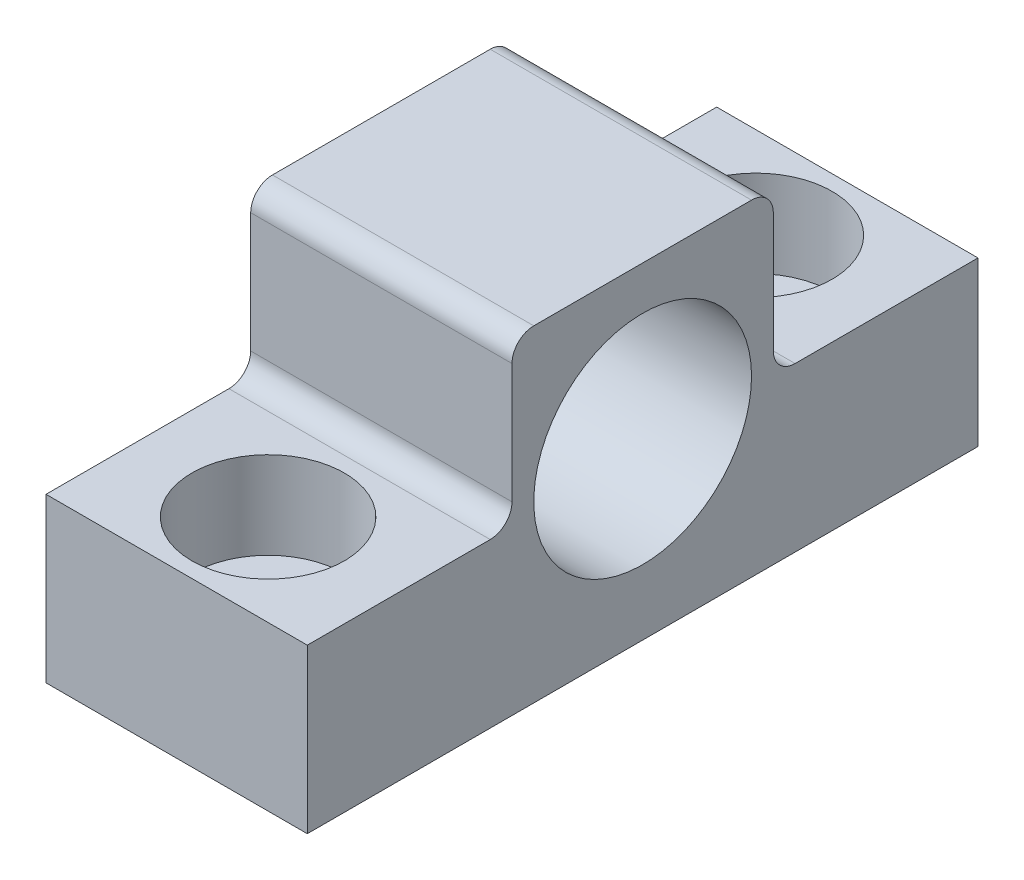
ISO-10303-21;
HEADER;
FILE_DESCRIPTION(('STEP AP214'),'2;1');
FILE_NAME('part.step','',(''),(''),'','','');
FILE_SCHEMA(('AUTOMOTIVE_DESIGN { 1 0 10303 214 1 1 1 1 }'));
ENDSEC;
DATA;
#1=APPLICATION_CONTEXT('core data for automotive mechanical design processes');
#2=APPLICATION_PROTOCOL_DEFINITION('international standard','automotive_design',2000,#1);
#3=PRODUCT_CONTEXT('',#1,'mechanical');
#4=PRODUCT('Part','Part','',(#3));
#5=PRODUCT_RELATED_PRODUCT_CATEGORY('part','',(#4));
#6=PRODUCT_DEFINITION_FORMATION('','',#4);
#7=PRODUCT_DEFINITION_CONTEXT('part definition',#1,'design');
#8=PRODUCT_DEFINITION('design','',#6,#7);
#9=PRODUCT_DEFINITION_SHAPE('','',#8);
#10=(LENGTH_UNIT() NAMED_UNIT(*) SI_UNIT(.MILLI.,.METRE.));
#11=(NAMED_UNIT(*) PLANE_ANGLE_UNIT() SI_UNIT($,.RADIAN.));
#12=(NAMED_UNIT(*) SI_UNIT($,.STERADIAN.) SOLID_ANGLE_UNIT());
#13=UNCERTAINTY_MEASURE_WITH_UNIT(LENGTH_MEASURE(1.E-05),#10,'distance_accuracy_value','');
#14=(GEOMETRIC_REPRESENTATION_CONTEXT(3) GLOBAL_UNCERTAINTY_ASSIGNED_CONTEXT((#13)) GLOBAL_UNIT_ASSIGNED_CONTEXT((#10,
#11,#12)) REPRESENTATION_CONTEXT('',''));
#15=CARTESIAN_POINT('',(0.,0.,0.));
#16=DIRECTION('',(0.,0.,1.));
#17=DIRECTION('',(1.,0.,0.));
#18=AXIS2_PLACEMENT_3D('',#15,#16,#17);
#19=CARTESIAN_POINT('',(4.,-15.001,-17.2));
#20=DIRECTION('',(0.,1.,0.));
#21=DIRECTION('',(0.,0.,1.));
#22=AXIS2_PLACEMENT_3D('',#19,#20,#21);
#23=CYLINDRICAL_SURFACE('',#22,2.);
#24=CARTESIAN_POINT('',(4.,-15.,-17.2));
#25=DIRECTION('',(0.,1.,0.));
#26=DIRECTION('',(0.,0.,1.));
#27=AXIS2_PLACEMENT_3D('',#24,#25,#26);
#28=CIRCLE('',#27,2.);
#29=CARTESIAN_POINT('',(4.,-15.,-15.2));
#30=VERTEX_POINT('',#29);
#31=EDGE_CURVE('E293',#30,#30,#28,.F.);
#32=ORIENTED_EDGE('',*,*,#31,.T.);
#33=EDGE_LOOP('',(#32));
#34=FACE_BOUND('',#33,.T.);
#35=CARTESIAN_POINT('',(4.,-11.5,-17.2));
#36=DIRECTION('',(0.,1.,0.));
#37=DIRECTION('',(0.,0.,1.));
#38=AXIS2_PLACEMENT_3D('',#35,#36,#37);
#39=CIRCLE('',#38,2.);
#40=CARTESIAN_POINT('',(4.,-11.5,-15.2));
#41=VERTEX_POINT('',#40);
#42=EDGE_CURVE('E54',#41,#41,#39,.F.);
#43=ORIENTED_EDGE('',*,*,#42,.F.);
#44=EDGE_LOOP('',(#43));
#45=FACE_BOUND('',#44,.T.);
#46=ADVANCED_FACE('F50',(#34,#45),#23,.F.);
#47=CARTESIAN_POINT('',(4.,-15.001,5.2));
#48=DIRECTION('',(0.,1.,0.));
#49=DIRECTION('',(0.,0.,1.));
#50=AXIS2_PLACEMENT_3D('',#47,#48,#49);
#51=CYLINDRICAL_SURFACE('',#50,2.);
#52=CARTESIAN_POINT('',(4.,-15.,5.2));
#53=DIRECTION('',(0.,1.,0.));
#54=DIRECTION('',(0.,0.,1.));
#55=AXIS2_PLACEMENT_3D('',#52,#53,#54);
#56=CIRCLE('',#55,2.);
#57=CARTESIAN_POINT('',(4.,-15.,7.2));
#58=VERTEX_POINT('',#57);
#59=EDGE_CURVE('E275',#58,#58,#56,.F.);
#60=ORIENTED_EDGE('',*,*,#59,.T.);
#61=EDGE_LOOP('',(#60));
#62=FACE_BOUND('',#61,.T.);
#63=CARTESIAN_POINT('',(4.,-11.5,5.2));
#64=DIRECTION('',(0.,1.,0.));
#65=DIRECTION('',(0.,0.,1.));
#66=AXIS2_PLACEMENT_3D('',#63,#64,#65);
#67=CIRCLE('',#66,2.);
#68=CARTESIAN_POINT('',(4.,-11.5,7.2));
#69=VERTEX_POINT('',#68);
#70=EDGE_CURVE('E266',#69,#69,#67,.F.);
#71=ORIENTED_EDGE('',*,*,#70,.F.);
#72=EDGE_LOOP('',(#71));
#73=FACE_BOUND('',#72,.T.);
#74=ADVANCED_FACE('F362',(#62,#73),#51,.F.);
#75=CARTESIAN_POINT('',(10.,0.,0.));
#76=DIRECTION('',(0.,0.,-1.));
#77=DIRECTION('',(0.,1.,0.));
#78=AXIS2_PLACEMENT_3D('',#75,#76,#77);
#79=PLANE('',#78);
#80=DIRECTION('',(0.,-1.,0.));
#81=VECTOR('',#80,1.);
#82=CARTESIAN_POINT('',(10.,0.,0.));
#83=LINE('',#82,#81);
#84=CARTESIAN_POINT('',(10.,-1.,0.));
#85=VERTEX_POINT('',#84);
#86=CARTESIAN_POINT('',(10.,-6.5,0.));
#87=VERTEX_POINT('',#86);
#88=EDGE_CURVE('E187',#85,#87,#83,.T.);
#89=ORIENTED_EDGE('',*,*,#88,.F.);
#90=DIRECTION('',(-1.,0.,0.));
#91=VECTOR('',#90,1.);
#92=CARTESIAN_POINT('',(10.,-1.,0.));
#93=LINE('',#92,#91);
#94=CARTESIAN_POINT('',(-2.,-1.,0.));
#95=VERTEX_POINT('',#94);
#96=EDGE_CURVE('E225',#85,#95,#93,.T.);
#97=ORIENTED_EDGE('',*,*,#96,.T.);
#98=DIRECTION('',(0.,1.,0.));
#99=VECTOR('',#98,1.);
#100=CARTESIAN_POINT('',(-2.,-7.5,0.));
#101=LINE('',#100,#99);
#102=CARTESIAN_POINT('',(-2.,-6.5,0.));
#103=VERTEX_POINT('',#102);
#104=EDGE_CURVE('E304',#103,#95,#101,.T.);
#105=ORIENTED_EDGE('',*,*,#104,.F.);
#106=DIRECTION('',(-1.,0.,0.));
#107=VECTOR('',#106,1.);
#108=CARTESIAN_POINT('',(10.,-6.5,0.));
#109=LINE('',#108,#107);
#110=EDGE_CURVE('E222',#103,#87,#109,.F.);
#111=ORIENTED_EDGE('',*,*,#110,.T.);
#112=EDGE_LOOP('',(#89,#97,#105,#111));
#113=FACE_BOUND('',#112,.T.);
#114=ADVANCED_FACE('F330',(#113),#79,.F.);
#115=CARTESIAN_POINT('',(10.,-7.5,0.));
#116=DIRECTION('',(0.,-1.,0.));
#117=DIRECTION('',(0.,0.,-1.));
#118=AXIS2_PLACEMENT_3D('',#115,#116,#117);
#119=PLANE('',#118);
#120=CARTESIAN_POINT('',(4.,-7.5,5.2));
#121=DIRECTION('',(0.,1.,0.));
#122=DIRECTION('',(0.,0.,1.));
#123=AXIS2_PLACEMENT_3D('',#120,#121,#122);
#124=CIRCLE('',#123,3.5);
#125=CARTESIAN_POINT('',(4.,-7.5,8.7));
#126=VERTEX_POINT('',#125);
#127=EDGE_CURVE('E277',#126,#126,#124,.T.);
#128=ORIENTED_EDGE('',*,*,#127,.F.);
#129=EDGE_LOOP('',(#128));
#130=FACE_BOUND('',#129,.T.);
#131=DIRECTION('',(0.,0.,1.));
#132=VECTOR('',#131,1.);
#133=CARTESIAN_POINT('',(10.,-7.5,0.));
#134=LINE('',#133,#132);
#135=CARTESIAN_POINT('',(10.,-7.5,0.999999999999999));
#136=VERTEX_POINT('',#135);
#137=CARTESIAN_POINT('',(10.,-7.5,9.4));
#138=VERTEX_POINT('',#137);
#139=EDGE_CURVE('E194',#136,#138,#134,.T.);
#140=ORIENTED_EDGE('',*,*,#139,.F.);
#141=DIRECTION('',(-1.,0.,0.));
#142=VECTOR('',#141,1.);
#143=CARTESIAN_POINT('',(-2.,-7.5,0.999999999999999));
#144=LINE('',#143,#142);
#145=CARTESIAN_POINT('',(-2.,-7.5,0.999999999999999));
#146=VERTEX_POINT('',#145);
#147=EDGE_CURVE('E257',#136,#146,#144,.T.);
#148=ORIENTED_EDGE('',*,*,#147,.T.);
#149=DIRECTION('',(0.,0.,-1.));
#150=VECTOR('',#149,1.);
#151=CARTESIAN_POINT('',(-2.,-7.5,9.4));
#152=LINE('',#151,#150);
#153=CARTESIAN_POINT('',(-2.,-7.5,9.4));
#154=VERTEX_POINT('',#153);
#155=EDGE_CURVE('E297',#154,#146,#152,.T.);
#156=ORIENTED_EDGE('',*,*,#155,.F.);
#157=DIRECTION('',(-1.,0.,0.));
#158=VECTOR('',#157,1.);
#159=CARTESIAN_POINT('',(10.,-7.5,9.4));
#160=LINE('',#159,#158);
#161=EDGE_CURVE('E219',#138,#154,#160,.T.);
#162=ORIENTED_EDGE('',*,*,#161,.F.);
#163=EDGE_LOOP('',(#140,#148,#156,#162));
#164=FACE_BOUND('',#163,.T.);
#165=ADVANCED_FACE('F338',(#130,#164),#119,.F.);
#166=CARTESIAN_POINT('',(10.,-15.,9.4));
#167=DIRECTION('',(0.,0.,-1.));
#168=DIRECTION('',(-1.,0.,0.));
#169=AXIS2_PLACEMENT_3D('',#166,#167,#168);
#170=PLANE('',#169);
#171=ORIENTED_EDGE('',*,*,#161,.T.);
#172=DIRECTION('',(0.,1.,0.));
#173=VECTOR('',#172,1.);
#174=CARTESIAN_POINT('',(-2.,-15.,9.4));
#175=LINE('',#174,#173);
#176=CARTESIAN_POINT('',(-2.,-15.,9.4));
#177=VERTEX_POINT('',#176);
#178=EDGE_CURVE('E175',#177,#154,#175,.T.);
#179=ORIENTED_EDGE('',*,*,#178,.F.);
#180=DIRECTION('',(-1.,0.,0.));
#181=VECTOR('',#180,1.);
#182=CARTESIAN_POINT('',(10.,-15.,9.4));
#183=LINE('',#182,#181);
#184=CARTESIAN_POINT('',(10.,-15.,9.4));
#185=VERTEX_POINT('',#184);
#186=EDGE_CURVE('E216',#185,#177,#183,.T.);
#187=ORIENTED_EDGE('',*,*,#186,.F.);
#188=DIRECTION('',(0.,-1.,0.));
#189=VECTOR('',#188,1.);
#190=CARTESIAN_POINT('',(10.,-15.,9.4));
#191=LINE('',#190,#189);
#192=EDGE_CURVE('E197',#138,#185,#191,.T.);
#193=ORIENTED_EDGE('',*,*,#192,.F.);
#194=EDGE_LOOP('',(#171,#179,#187,#193));
#195=FACE_BOUND('',#194,.T.);
#196=ADVANCED_FACE('F344',(#195),#170,.F.);
#197=CARTESIAN_POINT('',(10.,-15.,-21.4));
#198=DIRECTION('',(0.,1.,0.));
#199=DIRECTION('',(0.,0.,1.));
#200=AXIS2_PLACEMENT_3D('',#197,#198,#199);
#201=PLANE('',#200);
#202=ORIENTED_EDGE('',*,*,#31,.F.);
#203=EDGE_LOOP('',(#202));
#204=FACE_BOUND('',#203,.T.);
#205=ORIENTED_EDGE('',*,*,#59,.F.);
#206=EDGE_LOOP('',(#205));
#207=FACE_BOUND('',#206,.T.);
#208=ORIENTED_EDGE('',*,*,#186,.T.);
#209=DIRECTION('',(0.,0.,1.));
#210=VECTOR('',#209,1.);
#211=CARTESIAN_POINT('',(-2.,-15.,-21.4));
#212=LINE('',#211,#210);
#213=CARTESIAN_POINT('',(-2.,-15.,-21.4));
#214=VERTEX_POINT('',#213);
#215=EDGE_CURVE('E172',#214,#177,#212,.T.);
#216=ORIENTED_EDGE('',*,*,#215,.F.);
#217=DIRECTION('',(-1.,0.,0.));
#218=VECTOR('',#217,1.);
#219=CARTESIAN_POINT('',(10.,-15.,-21.4));
#220=LINE('',#219,#218);
#221=CARTESIAN_POINT('',(10.,-15.,-21.4));
#222=VERTEX_POINT('',#221);
#223=EDGE_CURVE('E166',#222,#214,#220,.T.);
#224=ORIENTED_EDGE('',*,*,#223,.F.);
#225=DIRECTION('',(0.,0.,-1.));
#226=VECTOR('',#225,1.);
#227=CARTESIAN_POINT('',(10.,-15.,-21.4));
#228=LINE('',#227,#226);
#229=EDGE_CURVE('E200',#185,#222,#228,.T.);
#230=ORIENTED_EDGE('',*,*,#229,.F.);
#231=EDGE_LOOP('',(#208,#216,#224,#230));
#232=FACE_BOUND('',#231,.T.);
#233=ADVANCED_FACE('F347',(#204,#207,#232),#201,.F.);
#234=CARTESIAN_POINT('',(10.,-7.5,-21.4));
#235=DIRECTION('',(0.,0.,1.));
#236=DIRECTION('',(1.,0.,0.));
#237=AXIS2_PLACEMENT_3D('',#234,#235,#236);
#238=PLANE('',#237);
#239=ORIENTED_EDGE('',*,*,#223,.T.);
#240=DIRECTION('',(0.,-1.,0.));
#241=VECTOR('',#240,1.);
#242=CARTESIAN_POINT('',(-2.,-7.5,-21.4));
#243=LINE('',#242,#241);
#244=CARTESIAN_POINT('',(-2.,-7.5,-21.4));
#245=VERTEX_POINT('',#244);
#246=EDGE_CURVE('E149',#245,#214,#243,.T.);
#247=ORIENTED_EDGE('',*,*,#246,.F.);
#248=DIRECTION('',(-1.,0.,0.));
#249=VECTOR('',#248,1.);
#250=CARTESIAN_POINT('',(10.,-7.5,-21.4));
#251=LINE('',#250,#249);
#252=CARTESIAN_POINT('',(10.,-7.5,-21.4));
#253=VERTEX_POINT('',#252);
#254=EDGE_CURVE('E160',#253,#245,#251,.T.);
#255=ORIENTED_EDGE('',*,*,#254,.F.);
#256=DIRECTION('',(0.,1.,0.));
#257=VECTOR('',#256,1.);
#258=CARTESIAN_POINT('',(10.,-7.5,-21.4));
#259=LINE('',#258,#257);
#260=EDGE_CURVE('E203',#222,#253,#259,.T.);
#261=ORIENTED_EDGE('',*,*,#260,.F.);
#262=EDGE_LOOP('',(#239,#247,#255,#261));
#263=FACE_BOUND('',#262,.T.);
#264=ADVANCED_FACE('F169',(#263),#238,.F.);
#265=CARTESIAN_POINT('',(10.,-7.5,-12.));
#266=DIRECTION('',(0.,-1.,0.));
#267=DIRECTION('',(0.,0.,-1.));
#268=AXIS2_PLACEMENT_3D('',#265,#266,#267);
#269=PLANE('',#268);
#270=CARTESIAN_POINT('',(4.,-7.5,-17.2));
#271=DIRECTION('',(0.,1.,0.));
#272=DIRECTION('',(0.,0.,1.));
#273=AXIS2_PLACEMENT_3D('',#270,#271,#272);
#274=CIRCLE('',#273,3.5);
#275=CARTESIAN_POINT('',(4.,-7.5,-13.7));
#276=VERTEX_POINT('',#275);
#277=EDGE_CURVE('E289',#276,#276,#274,.T.);
#278=ORIENTED_EDGE('',*,*,#277,.F.);
#279=EDGE_LOOP('',(#278));
#280=FACE_BOUND('',#279,.T.);
#281=DIRECTION('',(0.,0.,-1.));
#282=VECTOR('',#281,1.);
#283=CARTESIAN_POINT('',(-2.,-7.5,-12.));
#284=LINE('',#283,#282);
#285=CARTESIAN_POINT('',(-2.,-7.5,-13.));
#286=VERTEX_POINT('',#285);
#287=EDGE_CURVE('E143',#286,#245,#284,.T.);
#288=ORIENTED_EDGE('',*,*,#287,.F.);
#289=DIRECTION('',(-1.,0.,0.));
#290=VECTOR('',#289,1.);
#291=CARTESIAN_POINT('',(10.,-7.5,-13.));
#292=LINE('',#291,#290);
#293=CARTESIAN_POINT('',(10.,-7.5,-13.));
#294=VERTEX_POINT('',#293);
#295=EDGE_CURVE('E254',#286,#294,#292,.F.);
#296=ORIENTED_EDGE('',*,*,#295,.T.);
#297=DIRECTION('',(0.,0.,1.));
#298=VECTOR('',#297,1.);
#299=CARTESIAN_POINT('',(10.,-7.5,-12.));
#300=LINE('',#299,#298);
#301=EDGE_CURVE('E162',#253,#294,#300,.T.);
#302=ORIENTED_EDGE('',*,*,#301,.F.);
#303=ORIENTED_EDGE('',*,*,#254,.T.);
#304=EDGE_LOOP('',(#288,#296,#302,#303));
#305=FACE_BOUND('',#304,.T.);
#306=ADVANCED_FACE('F161',(#280,#305),#269,.F.);
#307=CARTESIAN_POINT('',(10.,0.,-12.));
#308=DIRECTION('',(0.,0.,1.));
#309=DIRECTION('',(0.,-1.,0.));
#310=AXIS2_PLACEMENT_3D('',#307,#308,#309);
#311=PLANE('',#310);
#312=DIRECTION('',(0.,-1.,0.));
#313=VECTOR('',#312,1.);
#314=CARTESIAN_POINT('',(-2.,0.,-12.));
#315=LINE('',#314,#313);
#316=CARTESIAN_POINT('',(-2.,-1.,-12.));
#317=VERTEX_POINT('',#316);
#318=CARTESIAN_POINT('',(-2.,-6.5,-12.));
#319=VERTEX_POINT('',#318);
#320=EDGE_CURVE('E156',#317,#319,#315,.T.);
#321=ORIENTED_EDGE('',*,*,#320,.F.);
#322=DIRECTION('',(-1.,0.,0.));
#323=VECTOR('',#322,1.);
#324=CARTESIAN_POINT('',(10.,-1.,-12.));
#325=LINE('',#324,#323);
#326=CARTESIAN_POINT('',(10.,-1.,-12.));
#327=VERTEX_POINT('',#326);
#328=EDGE_CURVE('E68',#317,#327,#325,.F.);
#329=ORIENTED_EDGE('',*,*,#328,.T.);
#330=DIRECTION('',(0.,1.,0.));
#331=VECTOR('',#330,1.);
#332=CARTESIAN_POINT('',(10.,0.,-12.));
#333=LINE('',#332,#331);
#334=CARTESIAN_POINT('',(10.,-6.5,-12.));
#335=VERTEX_POINT('',#334);
#336=EDGE_CURVE('E208',#335,#327,#333,.T.);
#337=ORIENTED_EDGE('',*,*,#336,.F.);
#338=DIRECTION('',(-1.,0.,0.));
#339=VECTOR('',#338,1.);
#340=CARTESIAN_POINT('',(-2.,-6.5,-12.));
#341=LINE('',#340,#339);
#342=EDGE_CURVE('E248',#335,#319,#341,.T.);
#343=ORIENTED_EDGE('',*,*,#342,.T.);
#344=EDGE_LOOP('',(#321,#329,#337,#343));
#345=FACE_BOUND('',#344,.T.);
#346=ADVANCED_FACE('F311',(#345),#311,.F.);
#347=CARTESIAN_POINT('',(10.,0.,0.));
#348=DIRECTION('',(0.,-1.,0.));
#349=DIRECTION('',(0.,0.,-1.));
#350=AXIS2_PLACEMENT_3D('',#347,#348,#349);
#351=PLANE('',#350);
#352=DIRECTION('',(0.,0.,-1.));
#353=VECTOR('',#352,1.);
#354=CARTESIAN_POINT('',(-2.,0.,0.));
#355=LINE('',#354,#353);
#356=CARTESIAN_POINT('',(-2.,0.,-1.));
#357=VERTEX_POINT('',#356);
#358=CARTESIAN_POINT('',(-2.,0.,-11.));
#359=VERTEX_POINT('',#358);
#360=EDGE_CURVE('E307',#357,#359,#355,.T.);
#361=ORIENTED_EDGE('',*,*,#360,.F.);
#362=DIRECTION('',(-1.,0.,0.));
#363=VECTOR('',#362,1.);
#364=CARTESIAN_POINT('',(10.,0.,-1.));
#365=LINE('',#364,#363);
#366=CARTESIAN_POINT('',(10.,0.,-1.));
#367=VERTEX_POINT('',#366);
#368=EDGE_CURVE('E239',#357,#367,#365,.F.);
#369=ORIENTED_EDGE('',*,*,#368,.T.);
#370=DIRECTION('',(0.,0.,1.));
#371=VECTOR('',#370,1.);
#372=CARTESIAN_POINT('',(10.,0.,0.));
#373=LINE('',#372,#371);
#374=CARTESIAN_POINT('',(10.,0.,-11.));
#375=VERTEX_POINT('',#374);
#376=EDGE_CURVE('E167',#375,#367,#373,.T.);
#377=ORIENTED_EDGE('',*,*,#376,.F.);
#378=DIRECTION('',(-1.,0.,0.));
#379=VECTOR('',#378,1.);
#380=CARTESIAN_POINT('',(10.,0.,-11.));
#381=LINE('',#380,#379);
#382=EDGE_CURVE('E235',#375,#359,#381,.T.);
#383=ORIENTED_EDGE('',*,*,#382,.T.);
#384=EDGE_LOOP('',(#361,#369,#377,#383));
#385=FACE_BOUND('',#384,.T.);
#386=ADVANCED_FACE('F322',(#385),#351,.F.);
#387=CARTESIAN_POINT('',(10.,0.,0.));
#388=DIRECTION('',(-1.,0.,0.));
#389=DIRECTION('',(0.,0.,1.));
#390=AXIS2_PLACEMENT_3D('',#387,#388,#389);
#391=PLANE('',#390);
#392=CARTESIAN_POINT('',(10.,-7.,-6.));
#393=DIRECTION('',(1.,0.,0.));
#394=DIRECTION('',(0.,0.,-1.));
#395=AXIS2_PLACEMENT_3D('',#392,#393,#394);
#396=CIRCLE('',#395,5.);
#397=CARTESIAN_POINT('',(10.,-7.,-11.));
#398=VERTEX_POINT('',#397);
#399=EDGE_CURVE('E183',#398,#398,#396,.T.);
#400=ORIENTED_EDGE('',*,*,#399,.F.);
#401=EDGE_LOOP('',(#400));
#402=FACE_BOUND('',#401,.T.);
#403=ORIENTED_EDGE('',*,*,#376,.T.);
#404=CARTESIAN_POINT('',(10.,-1.,-1.));
#405=DIRECTION('',(-1.,0.,0.));
#406=DIRECTION('',(0.,0.,1.));
#407=AXIS2_PLACEMENT_3D('',#404,#405,#406);
#408=CIRCLE('',#407,1.);
#409=EDGE_CURVE('E245',#367,#85,#408,.F.);
#410=ORIENTED_EDGE('',*,*,#409,.T.);
#411=ORIENTED_EDGE('',*,*,#88,.T.);
#412=CARTESIAN_POINT('',(10.,-6.5,0.999999999999999));
#413=DIRECTION('',(-1.,0.,0.));
#414=DIRECTION('',(0.,0.,1.));
#415=AXIS2_PLACEMENT_3D('',#412,#413,#414);
#416=CIRCLE('',#415,1.);
#417=EDGE_CURVE('E13',#87,#136,#416,.T.);
#418=ORIENTED_EDGE('',*,*,#417,.T.);
#419=ORIENTED_EDGE('',*,*,#139,.T.);
#420=ORIENTED_EDGE('',*,*,#192,.T.);
#421=ORIENTED_EDGE('',*,*,#229,.T.);
#422=ORIENTED_EDGE('',*,*,#260,.T.);
#423=ORIENTED_EDGE('',*,*,#301,.T.);
#424=CARTESIAN_POINT('',(10.,-6.5,-13.));
#425=DIRECTION('',(-1.,0.,0.));
#426=DIRECTION('',(0.,0.,1.));
#427=AXIS2_PLACEMENT_3D('',#424,#425,#426);
#428=CIRCLE('',#427,1.);
#429=EDGE_CURVE('E75',#294,#335,#428,.T.);
#430=ORIENTED_EDGE('',*,*,#429,.T.);
#431=ORIENTED_EDGE('',*,*,#336,.T.);
#432=CARTESIAN_POINT('',(10.,-1.,-11.));
#433=DIRECTION('',(-1.,0.,0.));
#434=DIRECTION('',(0.,0.,1.));
#435=AXIS2_PLACEMENT_3D('',#432,#433,#434);
#436=CIRCLE('',#435,1.);
#437=EDGE_CURVE('E242',#327,#375,#436,.F.);
#438=ORIENTED_EDGE('',*,*,#437,.T.);
#439=EDGE_LOOP('',(#403,#410,#411,#418,#419,#420,#421,#422,#423,#430,#431,#438));
#440=FACE_BOUND('',#439,.T.);
#441=ADVANCED_FACE('F318',(#402,#440),#391,.F.);
#442=CARTESIAN_POINT('',(-0.000999999999999265,-7.,-6.));
#443=DIRECTION('',(1.,0.,0.));
#444=DIRECTION('',(0.,0.,-1.));
#445=AXIS2_PLACEMENT_3D('',#442,#443,#444);
#446=CYLINDRICAL_SURFACE('',#445,5.);
#447=CARTESIAN_POINT('',(0.,-7.,-6.));
#448=DIRECTION('',(-1.,0.,0.));
#449=DIRECTION('',(0.,0.,1.));
#450=AXIS2_PLACEMENT_3D('',#447,#448,#449);
#451=CIRCLE('',#450,5.);
#452=CARTESIAN_POINT('',(0.,-7.,-1.));
#453=VERTEX_POINT('',#452);
#454=EDGE_CURVE('E182',#453,#453,#451,.F.);
#455=ORIENTED_EDGE('',*,*,#454,.F.);
#456=EDGE_LOOP('',(#455));
#457=FACE_BOUND('',#456,.T.);
#458=ORIENTED_EDGE('',*,*,#399,.T.);
#459=EDGE_LOOP('',(#458));
#460=FACE_BOUND('',#459,.T.);
#461=ADVANCED_FACE('F380',(#457,#460),#446,.F.);
#462=CARTESIAN_POINT('',(0.,0.,0.));
#463=DIRECTION('',(1.,0.,0.));
#464=DIRECTION('',(0.,0.,-1.));
#465=AXIS2_PLACEMENT_3D('',#462,#463,#464);
#466=PLANE('',#465);
#467=ORIENTED_EDGE('',*,*,#454,.T.);
#468=EDGE_LOOP('',(#467));
#469=FACE_BOUND('',#468,.T.);
#470=ADVANCED_FACE('F377',(#469),#466,.T.);
#471=CARTESIAN_POINT('',(-2.,0.,0.));
#472=DIRECTION('',(1.,0.,0.));
#473=DIRECTION('',(0.,0.,-1.));
#474=AXIS2_PLACEMENT_3D('',#471,#472,#473);
#475=PLANE('',#474);
#476=ORIENTED_EDGE('',*,*,#104,.T.);
#477=CARTESIAN_POINT('',(-2.,-1.,-1.));
#478=DIRECTION('',(1.,0.,0.));
#479=DIRECTION('',(0.,0.,-1.));
#480=AXIS2_PLACEMENT_3D('',#477,#478,#479);
#481=CIRCLE('',#480,1.);
#482=EDGE_CURVE('E232',#95,#357,#481,.F.);
#483=ORIENTED_EDGE('',*,*,#482,.T.);
#484=ORIENTED_EDGE('',*,*,#360,.T.);
#485=CARTESIAN_POINT('',(-2.,-1.,-11.));
#486=DIRECTION('',(1.,0.,0.));
#487=DIRECTION('',(0.,0.,-1.));
#488=AXIS2_PLACEMENT_3D('',#485,#486,#487);
#489=CIRCLE('',#488,1.);
#490=EDGE_CURVE('E229',#359,#317,#489,.F.);
#491=ORIENTED_EDGE('',*,*,#490,.T.);
#492=ORIENTED_EDGE('',*,*,#320,.T.);
#493=CARTESIAN_POINT('',(-2.,-6.5,-13.));
#494=DIRECTION('',(1.,0.,0.));
#495=DIRECTION('',(0.,0.,-1.));
#496=AXIS2_PLACEMENT_3D('',#493,#494,#495);
#497=CIRCLE('',#496,1.);
#498=EDGE_CURVE('E152',#319,#286,#497,.T.);
#499=ORIENTED_EDGE('',*,*,#498,.T.);
#500=ORIENTED_EDGE('',*,*,#287,.T.);
#501=ORIENTED_EDGE('',*,*,#246,.T.);
#502=ORIENTED_EDGE('',*,*,#215,.T.);
#503=ORIENTED_EDGE('',*,*,#178,.T.);
#504=ORIENTED_EDGE('',*,*,#155,.T.);
#505=CARTESIAN_POINT('',(-2.,-6.5,0.999999999999999));
#506=DIRECTION('',(1.,0.,0.));
#507=DIRECTION('',(0.,0.,-1.));
#508=AXIS2_PLACEMENT_3D('',#505,#506,#507);
#509=CIRCLE('',#508,1.);
#510=EDGE_CURVE('E60',#146,#103,#509,.T.);
#511=ORIENTED_EDGE('',*,*,#510,.T.);
#512=EDGE_LOOP('',(#476,#483,#484,#491,#492,#499,#500,#501,#502,#503,#504,#511));
#513=FACE_BOUND('',#512,.T.);
#514=ADVANCED_FACE('F146',(#513),#475,.F.);
#515=CARTESIAN_POINT('',(10.,-1.,-1.));
#516=DIRECTION('',(-1.,0.,0.));
#517=DIRECTION('',(0.,0.,1.));
#518=AXIS2_PLACEMENT_3D('',#515,#516,#517);
#519=CYLINDRICAL_SURFACE('',#518,1.);
#520=ORIENTED_EDGE('',*,*,#409,.F.);
#521=ORIENTED_EDGE('',*,*,#368,.F.);
#522=ORIENTED_EDGE('',*,*,#482,.F.);
#523=ORIENTED_EDGE('',*,*,#96,.F.);
#524=EDGE_LOOP('',(#520,#521,#522,#523));
#525=FACE_BOUND('',#524,.T.);
#526=ADVANCED_FACE('F325',(#525),#519,.T.);
#527=CARTESIAN_POINT('',(10.,-1.,-11.));
#528=DIRECTION('',(-1.,0.,0.));
#529=DIRECTION('',(0.,0.,1.));
#530=AXIS2_PLACEMENT_3D('',#527,#528,#529);
#531=CYLINDRICAL_SURFACE('',#530,1.);
#532=ORIENTED_EDGE('',*,*,#437,.F.);
#533=ORIENTED_EDGE('',*,*,#328,.F.);
#534=ORIENTED_EDGE('',*,*,#490,.F.);
#535=ORIENTED_EDGE('',*,*,#382,.F.);
#536=EDGE_LOOP('',(#532,#533,#534,#535));
#537=FACE_BOUND('',#536,.T.);
#538=ADVANCED_FACE('F315',(#537),#531,.T.);
#539=CARTESIAN_POINT('',(10.,-6.5,-13.));
#540=DIRECTION('',(1.,0.,0.));
#541=DIRECTION('',(0.,0.,-1.));
#542=AXIS2_PLACEMENT_3D('',#539,#540,#541);
#543=CYLINDRICAL_SURFACE('',#542,1.);
#544=ORIENTED_EDGE('',*,*,#429,.F.);
#545=ORIENTED_EDGE('',*,*,#295,.F.);
#546=ORIENTED_EDGE('',*,*,#498,.F.);
#547=ORIENTED_EDGE('',*,*,#342,.F.);
#548=EDGE_LOOP('',(#544,#545,#546,#547));
#549=FACE_BOUND('',#548,.T.);
#550=ADVANCED_FACE('F420',(#549),#543,.F.);
#551=CARTESIAN_POINT('',(10.,-6.5,0.999999999999999));
#552=DIRECTION('',(1.,0.,0.));
#553=DIRECTION('',(0.,0.,-1.));
#554=AXIS2_PLACEMENT_3D('',#551,#552,#553);
#555=CYLINDRICAL_SURFACE('',#554,1.);
#556=ORIENTED_EDGE('',*,*,#417,.F.);
#557=ORIENTED_EDGE('',*,*,#110,.F.);
#558=ORIENTED_EDGE('',*,*,#510,.F.);
#559=ORIENTED_EDGE('',*,*,#147,.F.);
#560=EDGE_LOOP('',(#556,#557,#558,#559));
#561=FACE_BOUND('',#560,.T.);
#562=ADVANCED_FACE('F52',(#561),#555,.F.);
#563=CARTESIAN_POINT('',(4.,-11.5,5.2));
#564=DIRECTION('',(0.,1.,0.));
#565=DIRECTION('',(0.,0.,1.));
#566=AXIS2_PLACEMENT_3D('',#563,#564,#565);
#567=PLANE('',#566);
#568=CARTESIAN_POINT('',(4.,-11.5,5.2));
#569=DIRECTION('',(0.,1.,0.));
#570=DIRECTION('',(0.,0.,1.));
#571=AXIS2_PLACEMENT_3D('',#568,#569,#570);
#572=CIRCLE('',#571,3.5);
#573=CARTESIAN_POINT('',(4.,-11.5,8.7));
#574=VERTEX_POINT('',#573);
#575=EDGE_CURVE('E269',#574,#574,#572,.T.);
#576=ORIENTED_EDGE('',*,*,#575,.T.);
#577=EDGE_LOOP('',(#576));
#578=FACE_BOUND('',#577,.T.);
#579=ORIENTED_EDGE('',*,*,#70,.T.);
#580=EDGE_LOOP('',(#579));
#581=FACE_BOUND('',#580,.T.);
#582=ADVANCED_FACE('F414',(#578,#581),#567,.T.);
#583=CARTESIAN_POINT('',(4.,-11.5,5.2));
#584=DIRECTION('',(0.,1.,0.));
#585=DIRECTION('',(0.,0.,1.));
#586=AXIS2_PLACEMENT_3D('',#583,#584,#585);
#587=CYLINDRICAL_SURFACE('',#586,3.5);
#588=ORIENTED_EDGE('',*,*,#575,.F.);
#589=EDGE_LOOP('',(#588));
#590=FACE_BOUND('',#589,.T.);
#591=ORIENTED_EDGE('',*,*,#127,.T.);
#592=EDGE_LOOP('',(#591));
#593=FACE_BOUND('',#592,.T.);
#594=ADVANCED_FACE('F406',(#590,#593),#587,.F.);
#595=CARTESIAN_POINT('',(4.,-11.5,-17.2));
#596=DIRECTION('',(0.,1.,0.));
#597=DIRECTION('',(0.,0.,1.));
#598=AXIS2_PLACEMENT_3D('',#595,#596,#597);
#599=PLANE('',#598);
#600=CARTESIAN_POINT('',(4.,-11.5,-17.2));
#601=DIRECTION('',(0.,1.,0.));
#602=DIRECTION('',(0.,0.,1.));
#603=AXIS2_PLACEMENT_3D('',#600,#601,#602);
#604=CIRCLE('',#603,3.5);
#605=CARTESIAN_POINT('',(4.,-11.5,-13.7));
#606=VERTEX_POINT('',#605);
#607=EDGE_CURVE('E283',#606,#606,#604,.T.);
#608=ORIENTED_EDGE('',*,*,#607,.T.);
#609=EDGE_LOOP('',(#608));
#610=FACE_BOUND('',#609,.T.);
#611=ORIENTED_EDGE('',*,*,#42,.T.);
#612=EDGE_LOOP('',(#611));
#613=FACE_BOUND('',#612,.T.);
#614=ADVANCED_FACE('F401',(#610,#613),#599,.T.);
#615=CARTESIAN_POINT('',(4.,-11.5,-17.2));
#616=DIRECTION('',(0.,1.,0.));
#617=DIRECTION('',(0.,0.,1.));
#618=AXIS2_PLACEMENT_3D('',#615,#616,#617);
#619=CYLINDRICAL_SURFACE('',#618,3.5);
#620=ORIENTED_EDGE('',*,*,#607,.F.);
#621=EDGE_LOOP('',(#620));
#622=FACE_BOUND('',#621,.T.);
#623=ORIENTED_EDGE('',*,*,#277,.T.);
#624=EDGE_LOOP('',(#623));
#625=FACE_BOUND('',#624,.T.);
#626=ADVANCED_FACE('F372',(#622,#625),#619,.F.);
#627=CLOSED_SHELL('',(#46,#74,#114,#165,#196,#233,#264,#306,#346,#386,#441,#461,#470,#514,#526,
#538,#550,#562,#582,#594,#614,#626));
#628=MANIFOLD_SOLID_BREP('B2',#627);
#629=ADVANCED_BREP_SHAPE_REPRESENTATION('',(#18,#628),#14);
#630=SHAPE_DEFINITION_REPRESENTATION(#9,#629);
ENDSEC;
END-ISO-10303-21;
